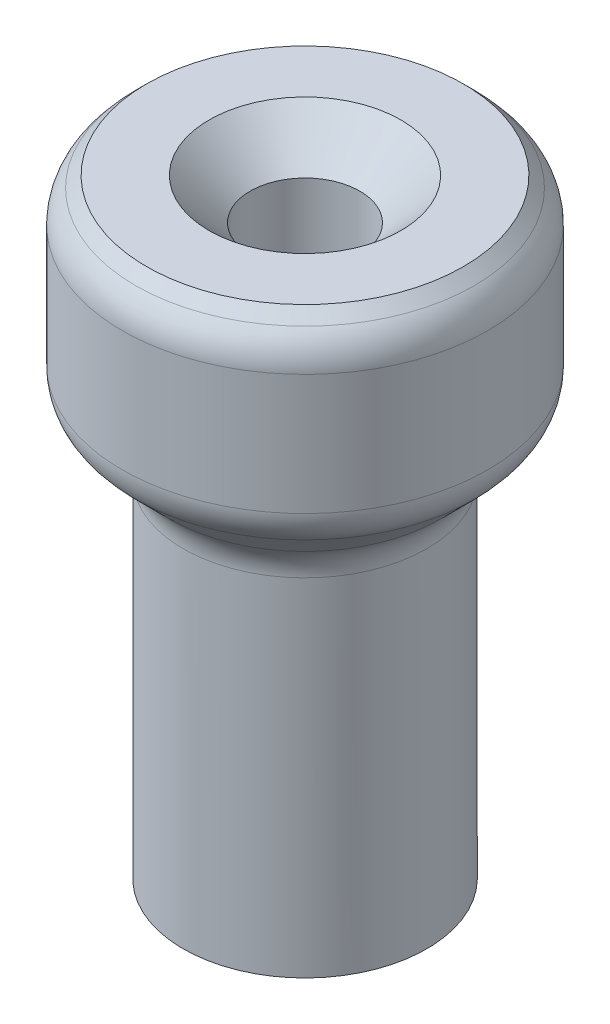
ISO-10303-21;
HEADER;
FILE_DESCRIPTION(('STEP AP214'),'2;1');
FILE_NAME('part.step','',(''),(''),'','','');
FILE_SCHEMA(('AUTOMOTIVE_DESIGN { 1 0 10303 214 1 1 1 1 }'));
ENDSEC;
DATA;
#1=APPLICATION_CONTEXT('core data for automotive mechanical design processes');
#2=APPLICATION_PROTOCOL_DEFINITION('international standard','automotive_design',2000,#1);
#3=PRODUCT_CONTEXT('',#1,'mechanical');
#4=PRODUCT('Part','Part','',(#3));
#5=PRODUCT_RELATED_PRODUCT_CATEGORY('part','',(#4));
#6=PRODUCT_DEFINITION_FORMATION('','',#4);
#7=PRODUCT_DEFINITION_CONTEXT('part definition',#1,'design');
#8=PRODUCT_DEFINITION('design','',#6,#7);
#9=PRODUCT_DEFINITION_SHAPE('','',#8);
#10=(LENGTH_UNIT() NAMED_UNIT(*) SI_UNIT(.MILLI.,.METRE.));
#11=(NAMED_UNIT(*) PLANE_ANGLE_UNIT() SI_UNIT($,.RADIAN.));
#12=(NAMED_UNIT(*) SI_UNIT($,.STERADIAN.) SOLID_ANGLE_UNIT());
#13=UNCERTAINTY_MEASURE_WITH_UNIT(LENGTH_MEASURE(1.E-05),#10,'distance_accuracy_value','');
#14=(GEOMETRIC_REPRESENTATION_CONTEXT(3) GLOBAL_UNCERTAINTY_ASSIGNED_CONTEXT((#13)) GLOBAL_UNIT_ASSIGNED_CONTEXT((#10,
#11,#12)) REPRESENTATION_CONTEXT('',''));
#15=CARTESIAN_POINT('',(0.,0.,0.));
#16=DIRECTION('',(0.,0.,1.));
#17=DIRECTION('',(1.,0.,0.));
#18=AXIS2_PLACEMENT_3D('',#15,#16,#17);
#19=CARTESIAN_POINT('',(0.,0.,0.));
#20=DIRECTION('',(0.,1.,0.));
#21=DIRECTION('',(-1.,0.,0.));
#22=AXIS2_PLACEMENT_3D('',#19,#20,#21);
#23=CYLINDRICAL_SURFACE('',#22,4.);
#24=CARTESIAN_POINT('',(0.,-2.62132034355964,0.));
#25=DIRECTION('',(0.,-1.,0.));
#26=DIRECTION('',(1.,0.,0.));
#27=AXIS2_PLACEMENT_3D('',#24,#25,#26);
#28=CIRCLE('',#27,4.);
#29=CARTESIAN_POINT('',(4.,-2.62132034355964,0.));
#30=VERTEX_POINT('',#29);
#31=EDGE_CURVE('E10',#30,#30,#28,.T.);
#32=ORIENTED_EDGE('',*,*,#31,.T.);
#33=EDGE_LOOP('',(#32));
#34=FACE_BOUND('',#33,.T.);
#35=CARTESIAN_POINT('',(0.,-14.,0.));
#36=DIRECTION('',(0.,1.,0.));
#37=DIRECTION('',(-1.,0.,0.));
#38=AXIS2_PLACEMENT_3D('',#35,#36,#37);
#39=CIRCLE('',#38,4.);
#40=CARTESIAN_POINT('',(-4.,-14.,0.));
#41=VERTEX_POINT('',#40);
#42=EDGE_CURVE('E70',#41,#41,#39,.T.);
#43=ORIENTED_EDGE('',*,*,#42,.T.);
#44=EDGE_LOOP('',(#43));
#45=FACE_BOUND('',#44,.T.);
#46=ADVANCED_FACE('F41',(#34,#45),#23,.T.);
#47=CARTESIAN_POINT('',(0.,-14.,0.));
#48=DIRECTION('',(0.,1.,0.));
#49=DIRECTION('',(-1.,0.,0.));
#50=AXIS2_PLACEMENT_3D('',#47,#48,#49);
#51=PLANE('',#50);
#52=CARTESIAN_POINT('',(0.,-14.,0.));
#53=DIRECTION('',(0.,1.,0.));
#54=DIRECTION('',(0.,0.,1.));
#55=AXIS2_PLACEMENT_3D('',#52,#53,#54);
#56=CIRCLE('',#55,1.79999999999999);
#57=CARTESIAN_POINT('',(0.,-14.,1.79999999999999));
#58=VERTEX_POINT('',#57);
#59=EDGE_CURVE('E73',#58,#58,#56,.T.);
#60=ORIENTED_EDGE('',*,*,#59,.T.);
#61=EDGE_LOOP('',(#60));
#62=FACE_BOUND('',#61,.T.);
#63=ORIENTED_EDGE('',*,*,#42,.F.);
#64=EDGE_LOOP('',(#63));
#65=FACE_BOUND('',#64,.T.);
#66=ADVANCED_FACE('F88',(#62,#65),#51,.F.);
#67=CARTESIAN_POINT('',(0.,6.,0.));
#68=DIRECTION('',(0.,1.,0.));
#69=DIRECTION('',(-1.,0.,0.));
#70=AXIS2_PLACEMENT_3D('',#67,#68,#69);
#71=PLANE('',#70);
#72=CARTESIAN_POINT('',(0.,6.,0.));
#73=DIRECTION('',(0.,1.,0.));
#74=DIRECTION('',(-1.,0.,0.));
#75=AXIS2_PLACEMENT_3D('',#72,#73,#74);
#76=CIRCLE('',#75,5.2);
#77=CARTESIAN_POINT('',(-5.2,6.,0.));
#78=VERTEX_POINT('',#77);
#79=EDGE_CURVE('E67',#78,#78,#76,.T.);
#80=ORIENTED_EDGE('',*,*,#79,.T.);
#81=EDGE_LOOP('',(#80));
#82=FACE_BOUND('',#81,.T.);
#83=CARTESIAN_POINT('',(0.,6.,0.));
#84=DIRECTION('',(0.,1.,0.));
#85=DIRECTION('',(0.,0.,1.));
#86=AXIS2_PLACEMENT_3D('',#83,#84,#85);
#87=CIRCLE('',#86,3.15);
#88=CARTESIAN_POINT('',(0.,6.,3.15));
#89=VERTEX_POINT('',#88);
#90=EDGE_CURVE('E79',#89,#89,#87,.T.);
#91=ORIENTED_EDGE('',*,*,#90,.F.);
#92=EDGE_LOOP('',(#91));
#93=FACE_BOUND('',#92,.T.);
#94=ADVANCED_FACE('F85',(#82,#93),#71,.T.);
#95=CARTESIAN_POINT('',(0.,0.,0.));
#96=DIRECTION('',(0.,1.,0.));
#97=DIRECTION('',(-1.,0.,0.));
#98=AXIS2_PLACEMENT_3D('',#95,#96,#97);
#99=CYLINDRICAL_SURFACE('',#98,6.);
#100=CARTESIAN_POINT('',(0.,4.57867965644035,0.));
#101=DIRECTION('',(0.,1.,0.));
#102=DIRECTION('',(-1.,0.,0.));
#103=AXIS2_PLACEMENT_3D('',#100,#101,#102);
#104=CIRCLE('',#103,6.);
#105=CARTESIAN_POINT('',(-6.,4.57867965644035,0.));
#106=VERTEX_POINT('',#105);
#107=EDGE_CURVE('E61',#106,#106,#104,.F.);
#108=ORIENTED_EDGE('',*,*,#107,.T.);
#109=EDGE_LOOP('',(#108));
#110=FACE_BOUND('',#109,.T.);
#111=CARTESIAN_POINT('',(0.,0.621320343559634,0.));
#112=DIRECTION('',(0.,-1.,0.));
#113=DIRECTION('',(1.,0.,0.));
#114=AXIS2_PLACEMENT_3D('',#111,#112,#113);
#115=CIRCLE('',#114,6.);
#116=CARTESIAN_POINT('',(6.,0.621320343559635,0.));
#117=VERTEX_POINT('',#116);
#118=EDGE_CURVE('E64',#117,#117,#115,.F.);
#119=ORIENTED_EDGE('',*,*,#118,.T.);
#120=EDGE_LOOP('',(#119));
#121=FACE_BOUND('',#120,.T.);
#122=ADVANCED_FACE('F87',(#110,#121),#99,.T.);
#123=CARTESIAN_POINT('',(0.,6.,0.));
#124=DIRECTION('',(0.,1.,0.));
#125=DIRECTION('',(0.,0.,1.));
#126=AXIS2_PLACEMENT_3D('',#123,#124,#125);
#127=CYLINDRICAL_SURFACE('',#126,1.8);
#128=ORIENTED_EDGE('',*,*,#59,.F.);
#129=EDGE_LOOP('',(#128));
#130=FACE_BOUND('',#129,.T.);
#131=CARTESIAN_POINT('',(0.,4.65,0.));
#132=DIRECTION('',(0.,1.,0.));
#133=DIRECTION('',(0.,0.,1.));
#134=AXIS2_PLACEMENT_3D('',#131,#132,#133);
#135=CIRCLE('',#134,1.8);
#136=CARTESIAN_POINT('',(0.,4.65,1.8));
#137=VERTEX_POINT('',#136);
#138=EDGE_CURVE('E76',#137,#137,#135,.T.);
#139=ORIENTED_EDGE('',*,*,#138,.T.);
#140=EDGE_LOOP('',(#139));
#141=FACE_BOUND('',#140,.T.);
#142=ADVANCED_FACE('F96',(#130,#141),#127,.F.);
#143=CARTESIAN_POINT('',(0.,6.,0.));
#144=DIRECTION('',(0.,1.,0.));
#145=DIRECTION('',(0.,0.,1.));
#146=AXIS2_PLACEMENT_3D('',#143,#144,#145);
#147=CONICAL_SURFACE('',#146,3.15,0.785398163397449);
#148=ORIENTED_EDGE('',*,*,#138,.F.);
#149=EDGE_LOOP('',(#148));
#150=FACE_BOUND('',#149,.T.);
#151=ORIENTED_EDGE('',*,*,#90,.T.);
#152=EDGE_LOOP('',(#151));
#153=FACE_BOUND('',#152,.T.);
#154=ADVANCED_FACE('F83',(#150,#153),#147,.F.);
#155=CARTESIAN_POINT('',(0.,0.,0.));
#156=DIRECTION('',(0.,1.,0.));
#157=DIRECTION('',(-1.,0.,0.));
#158=AXIS2_PLACEMENT_3D('',#155,#156,#157);
#159=CONICAL_SURFACE('',#158,6.00000000000001,0.785398163397453);
#160=CARTESIAN_POINT('',(0.,-0.439339828220192,0.));
#161=DIRECTION('',(0.,-1.,0.));
#162=DIRECTION('',(1.,0.,0.));
#163=AXIS2_PLACEMENT_3D('',#160,#161,#162);
#164=CIRCLE('',#163,5.56066017177982);
#165=CARTESIAN_POINT('',(5.56066017177982,-0.439339828220192,0.));
#166=VERTEX_POINT('',#165);
#167=EDGE_CURVE('E48',#166,#166,#164,.T.);
#168=ORIENTED_EDGE('',*,*,#167,.T.);
#169=EDGE_LOOP('',(#168));
#170=FACE_BOUND('',#169,.T.);
#171=CARTESIAN_POINT('',(0.,-1.56066017177981,0.));
#172=DIRECTION('',(0.,-1.,0.));
#173=DIRECTION('',(1.,0.,0.));
#174=AXIS2_PLACEMENT_3D('',#171,#172,#173);
#175=CIRCLE('',#174,4.43933982822018);
#176=CARTESIAN_POINT('',(4.43933982822018,-1.56066017177981,0.));
#177=VERTEX_POINT('',#176);
#178=EDGE_CURVE('E52',#177,#177,#175,.F.);
#179=ORIENTED_EDGE('',*,*,#178,.T.);
#180=EDGE_LOOP('',(#179));
#181=FACE_BOUND('',#180,.T.);
#182=ADVANCED_FACE('F105',(#170,#181),#159,.T.);
#183=CARTESIAN_POINT('',(0.,6.,0.));
#184=DIRECTION('',(0.,-1.,0.));
#185=DIRECTION('',(1.,0.,0.));
#186=AXIS2_PLACEMENT_3D('',#183,#184,#185);
#187=CONICAL_SURFACE('',#186,5.2,0.785398163397446);
#188=CARTESIAN_POINT('',(0.,5.63933982822017,0.));
#189=DIRECTION('',(0.,-1.,0.));
#190=DIRECTION('',(1.,0.,0.));
#191=AXIS2_PLACEMENT_3D('',#188,#189,#190);
#192=CIRCLE('',#191,5.56066017177982);
#193=CARTESIAN_POINT('',(5.56066017177982,5.63933982822017,0.));
#194=VERTEX_POINT('',#193);
#195=EDGE_CURVE('E56',#194,#194,#192,.F.);
#196=ORIENTED_EDGE('',*,*,#195,.T.);
#197=EDGE_LOOP('',(#196));
#198=FACE_BOUND('',#197,.T.);
#199=ORIENTED_EDGE('',*,*,#79,.F.);
#200=EDGE_LOOP('',(#199));
#201=FACE_BOUND('',#200,.T.);
#202=ADVANCED_FACE('F111',(#198,#201),#187,.T.);
#203=CARTESIAN_POINT('',(0.,4.57867965644035,0.));
#204=DIRECTION('',(0.,1.,0.));
#205=DIRECTION('',(-1.,0.,0.));
#206=AXIS2_PLACEMENT_3D('',#203,#204,#205);
#207=TOROIDAL_SURFACE('',#206,4.5,1.5);
#208=ORIENTED_EDGE('',*,*,#195,.F.);
#209=EDGE_LOOP('',(#208));
#210=FACE_BOUND('',#209,.T.);
#211=ORIENTED_EDGE('',*,*,#107,.F.);
#212=EDGE_LOOP('',(#211));
#213=FACE_BOUND('',#212,.T.);
#214=ADVANCED_FACE('F116',(#210,#213),#207,.T.);
#215=CARTESIAN_POINT('',(0.,0.621320343559634,0.));
#216=DIRECTION('',(0.,-1.,0.));
#217=DIRECTION('',(1.,0.,0.));
#218=AXIS2_PLACEMENT_3D('',#215,#216,#217);
#219=TOROIDAL_SURFACE('',#218,4.5,1.5);
#220=ORIENTED_EDGE('',*,*,#167,.F.);
#221=EDGE_LOOP('',(#220));
#222=FACE_BOUND('',#221,.T.);
#223=ORIENTED_EDGE('',*,*,#118,.F.);
#224=EDGE_LOOP('',(#223));
#225=FACE_BOUND('',#224,.T.);
#226=ADVANCED_FACE('F119',(#222,#225),#219,.T.);
#227=CARTESIAN_POINT('',(0.,-2.62132034355964,0.));
#228=DIRECTION('',(0.,-1.,0.));
#229=DIRECTION('',(1.,0.,0.));
#230=AXIS2_PLACEMENT_3D('',#227,#228,#229);
#231=TOROIDAL_SURFACE('',#230,5.5,1.5);
#232=ORIENTED_EDGE('',*,*,#178,.F.);
#233=EDGE_LOOP('',(#232));
#234=FACE_BOUND('',#233,.T.);
#235=ORIENTED_EDGE('',*,*,#31,.F.);
#236=EDGE_LOOP('',(#235));
#237=FACE_BOUND('',#236,.T.);
#238=ADVANCED_FACE('F43',(#234,#237),#231,.F.);
#239=CLOSED_SHELL('',(#46,#66,#94,#122,#142,#154,#182,#202,#214,#226,#238));
#240=MANIFOLD_SOLID_BREP('B2',#239);
#241=ADVANCED_BREP_SHAPE_REPRESENTATION('',(#18,#240),#14);
#242=SHAPE_DEFINITION_REPRESENTATION(#9,#241);
ENDSEC;
END-ISO-10303-21;
